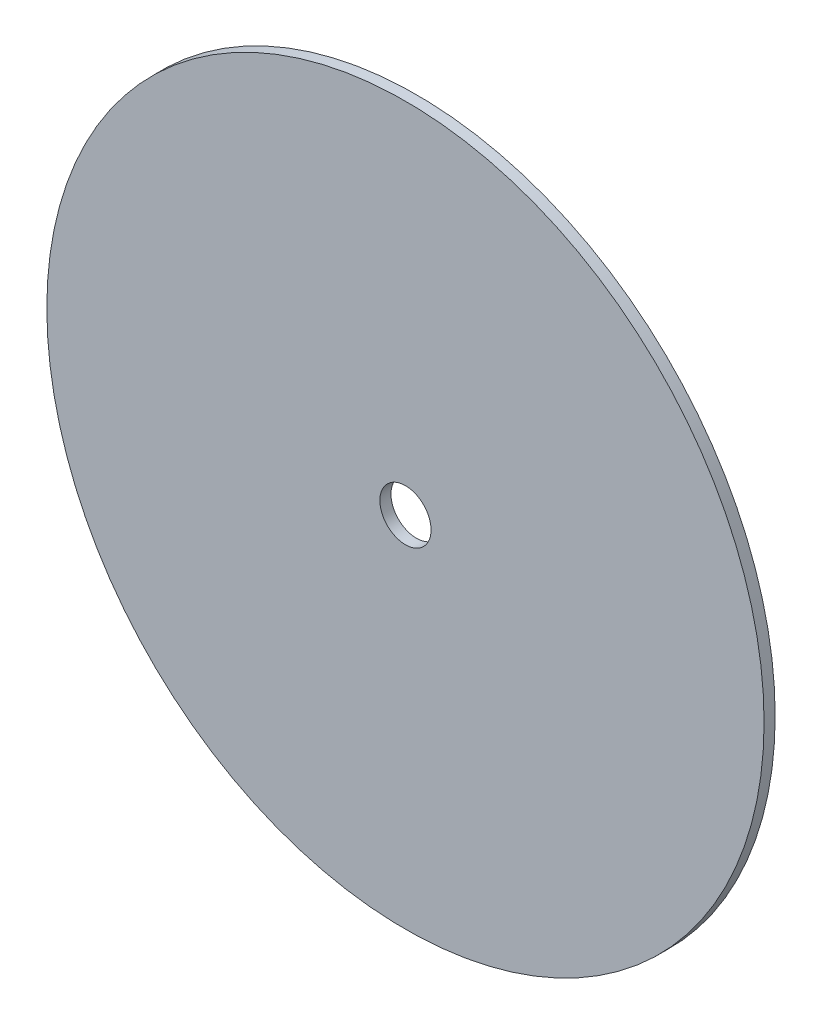
ISO-10303-21;
HEADER;
FILE_DESCRIPTION(('STEP AP214'),'2;1');
FILE_NAME('part.step','',(''),(''),'','','');
FILE_SCHEMA(('AUTOMOTIVE_DESIGN { 1 0 10303 214 1 1 1 1 }'));
ENDSEC;
DATA;
#1=APPLICATION_CONTEXT('core data for automotive mechanical design processes');
#2=APPLICATION_PROTOCOL_DEFINITION('international standard','automotive_design',2000,#1);
#3=PRODUCT_CONTEXT('',#1,'mechanical');
#4=PRODUCT('Part','Part','',(#3));
#5=PRODUCT_RELATED_PRODUCT_CATEGORY('part','',(#4));
#6=PRODUCT_DEFINITION_FORMATION('','',#4);
#7=PRODUCT_DEFINITION_CONTEXT('part definition',#1,'design');
#8=PRODUCT_DEFINITION('design','',#6,#7);
#9=PRODUCT_DEFINITION_SHAPE('','',#8);
#10=(LENGTH_UNIT() NAMED_UNIT(*) SI_UNIT(.MILLI.,.METRE.));
#11=(NAMED_UNIT(*) PLANE_ANGLE_UNIT() SI_UNIT($,.RADIAN.));
#12=(NAMED_UNIT(*) SI_UNIT($,.STERADIAN.) SOLID_ANGLE_UNIT());
#13=UNCERTAINTY_MEASURE_WITH_UNIT(LENGTH_MEASURE(1.E-05),#10,'distance_accuracy_value','');
#14=(GEOMETRIC_REPRESENTATION_CONTEXT(3) GLOBAL_UNCERTAINTY_ASSIGNED_CONTEXT((#13)) GLOBAL_UNIT_ASSIGNED_CONTEXT((#10,
#11,#12)) REPRESENTATION_CONTEXT('',''));
#15=CARTESIAN_POINT('',(0.,0.,0.));
#16=DIRECTION('',(0.,0.,1.));
#17=DIRECTION('',(1.,0.,0.));
#18=AXIS2_PLACEMENT_3D('',#15,#16,#17);
#19=CARTESIAN_POINT('',(0.,0.,-0.7366));
#20=DIRECTION('',(0.,0.,1.));
#21=DIRECTION('',(1.,0.,0.));
#22=AXIS2_PLACEMENT_3D('',#19,#20,#21);
#23=CYLINDRICAL_SURFACE('',#22,23.8196276937259);
#24=CARTESIAN_POINT('',(0.,0.,-0.7366));
#25=DIRECTION('',(0.,0.,1.));
#26=DIRECTION('',(1.,0.,0.));
#27=AXIS2_PLACEMENT_3D('',#24,#25,#26);
#28=CIRCLE('',#27,23.8196276937259);
#29=CARTESIAN_POINT('',(23.8196276937259,0.,-0.7366));
#30=VERTEX_POINT('',#29);
#31=EDGE_CURVE('E10',#30,#30,#28,.T.);
#32=ORIENTED_EDGE('',*,*,#31,.T.);
#33=EDGE_LOOP('',(#32));
#34=FACE_BOUND('',#33,.T.);
#35=CARTESIAN_POINT('',(0.,0.,0.));
#36=DIRECTION('',(0.,0.,1.));
#37=DIRECTION('',(1.,0.,0.));
#38=AXIS2_PLACEMENT_3D('',#35,#36,#37);
#39=CIRCLE('',#38,23.8196276937259);
#40=CARTESIAN_POINT('',(23.8196276937259,0.,0.));
#41=VERTEX_POINT('',#40);
#42=EDGE_CURVE('E38',#41,#41,#39,.T.);
#43=ORIENTED_EDGE('',*,*,#42,.F.);
#44=EDGE_LOOP('',(#43));
#45=FACE_BOUND('',#44,.T.);
#46=ADVANCED_FACE('F35',(#34,#45),#23,.T.);
#47=CARTESIAN_POINT('',(0.,0.,-0.7366));
#48=DIRECTION('',(0.,0.,1.));
#49=DIRECTION('',(1.,0.,0.));
#50=AXIS2_PLACEMENT_3D('',#47,#48,#49);
#51=PLANE('',#50);
#52=CARTESIAN_POINT('',(0.,0.,-0.7366));
#53=DIRECTION('',(0.,0.,1.));
#54=DIRECTION('',(1.,0.,0.));
#55=AXIS2_PLACEMENT_3D('',#52,#53,#54);
#56=CIRCLE('',#55,1.69923160137842);
#57=CARTESIAN_POINT('',(1.69923160137842,0.,-0.7366));
#58=VERTEX_POINT('',#57);
#59=EDGE_CURVE('E45',#58,#58,#56,.T.);
#60=ORIENTED_EDGE('',*,*,#59,.T.);
#61=EDGE_LOOP('',(#60));
#62=FACE_BOUND('',#61,.T.);
#63=ORIENTED_EDGE('',*,*,#31,.F.);
#64=EDGE_LOOP('',(#63));
#65=FACE_BOUND('',#64,.T.);
#66=ADVANCED_FACE('F53',(#62,#65),#51,.F.);
#67=CARTESIAN_POINT('',(0.,0.,0.));
#68=DIRECTION('',(0.,0.,1.));
#69=DIRECTION('',(1.,0.,0.));
#70=AXIS2_PLACEMENT_3D('',#67,#68,#69);
#71=PLANE('',#70);
#72=CARTESIAN_POINT('',(0.,0.,0.));
#73=DIRECTION('',(0.,0.,1.));
#74=DIRECTION('',(1.,0.,0.));
#75=AXIS2_PLACEMENT_3D('',#72,#73,#74);
#76=CIRCLE('',#75,1.69923160137842);
#77=CARTESIAN_POINT('',(1.69923160137842,0.,0.));
#78=VERTEX_POINT('',#77);
#79=EDGE_CURVE('E47',#78,#78,#76,.T.);
#80=ORIENTED_EDGE('',*,*,#79,.F.);
#81=EDGE_LOOP('',(#80));
#82=FACE_BOUND('',#81,.T.);
#83=ORIENTED_EDGE('',*,*,#42,.T.);
#84=EDGE_LOOP('',(#83));
#85=FACE_BOUND('',#84,.T.);
#86=ADVANCED_FACE('F59',(#82,#85),#71,.T.);
#87=CARTESIAN_POINT('',(0.,0.,-0.7366));
#88=DIRECTION('',(0.,0.,1.));
#89=DIRECTION('',(1.,0.,0.));
#90=AXIS2_PLACEMENT_3D('',#87,#88,#89);
#91=CYLINDRICAL_SURFACE('',#90,1.69923160137842);
#92=ORIENTED_EDGE('',*,*,#59,.F.);
#93=EDGE_LOOP('',(#92));
#94=FACE_BOUND('',#93,.T.);
#95=ORIENTED_EDGE('',*,*,#79,.T.);
#96=EDGE_LOOP('',(#95));
#97=FACE_BOUND('',#96,.T.);
#98=ADVANCED_FACE('F56',(#94,#97),#91,.F.);
#99=CLOSED_SHELL('',(#46,#66,#86,#98));
#100=MANIFOLD_SOLID_BREP('B2',#99);
#101=ADVANCED_BREP_SHAPE_REPRESENTATION('',(#18,#100),#14);
#102=SHAPE_DEFINITION_REPRESENTATION(#9,#101);
ENDSEC;
END-ISO-10303-21;
